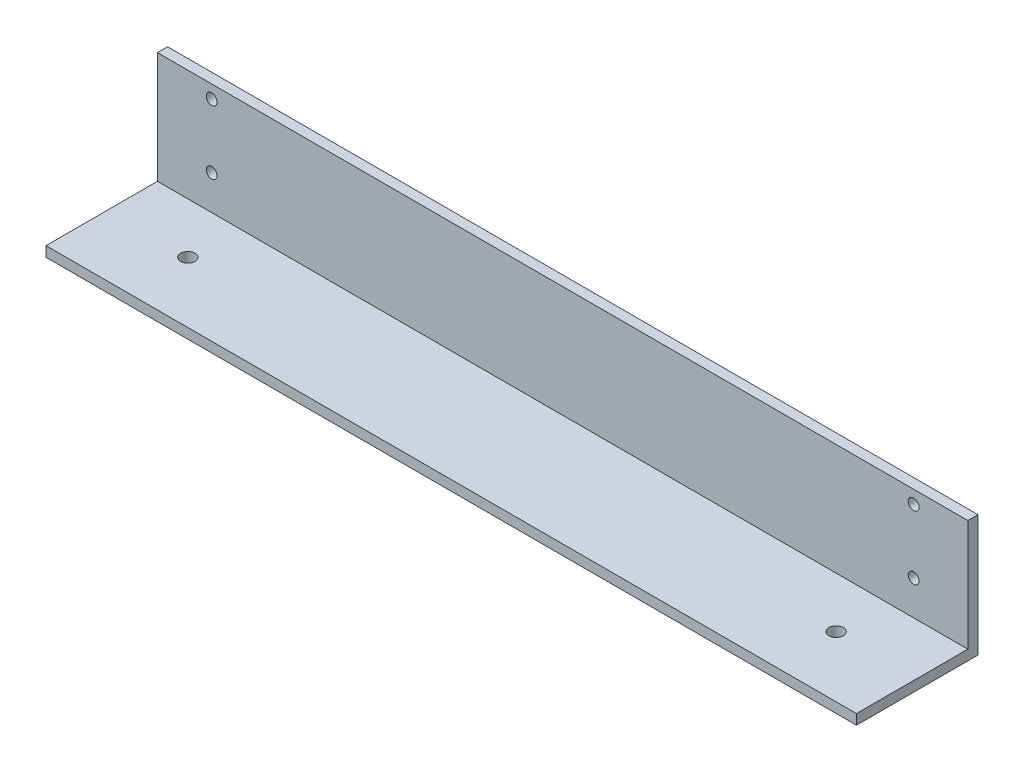
ISO-10303-21;
HEADER;
FILE_DESCRIPTION(('STEP AP214'),'2;1');
FILE_NAME('part.step','',(''),(''),'','','');
FILE_SCHEMA(('AUTOMOTIVE_DESIGN { 1 0 10303 214 1 1 1 1 }'));
ENDSEC;
DATA;
#1=APPLICATION_CONTEXT('core data for automotive mechanical design processes');
#2=APPLICATION_PROTOCOL_DEFINITION('international standard','automotive_design',2000,#1);
#3=PRODUCT_CONTEXT('',#1,'mechanical');
#4=PRODUCT('Part','Part','',(#3));
#5=PRODUCT_RELATED_PRODUCT_CATEGORY('part','',(#4));
#6=PRODUCT_DEFINITION_FORMATION('','',#4);
#7=PRODUCT_DEFINITION_CONTEXT('part definition',#1,'design');
#8=PRODUCT_DEFINITION('design','',#6,#7);
#9=PRODUCT_DEFINITION_SHAPE('','',#8);
#10=(LENGTH_UNIT() NAMED_UNIT(*) SI_UNIT(.MILLI.,.METRE.));
#11=(NAMED_UNIT(*) PLANE_ANGLE_UNIT() SI_UNIT($,.RADIAN.));
#12=(NAMED_UNIT(*) SI_UNIT($,.STERADIAN.) SOLID_ANGLE_UNIT());
#13=UNCERTAINTY_MEASURE_WITH_UNIT(LENGTH_MEASURE(1.E-05),#10,'distance_accuracy_value','');
#14=(GEOMETRIC_REPRESENTATION_CONTEXT(3) GLOBAL_UNCERTAINTY_ASSIGNED_CONTEXT((#13)) GLOBAL_UNIT_ASSIGNED_CONTEXT((#10,
#11,#12)) REPRESENTATION_CONTEXT('',''));
#15=CARTESIAN_POINT('',(0.,0.,0.));
#16=DIRECTION('',(0.,0.,1.));
#17=DIRECTION('',(1.,0.,0.));
#18=AXIS2_PLACEMENT_3D('',#15,#16,#17);
#19=CARTESIAN_POINT('',(254.,0.,0.));
#20=DIRECTION('',(0.,0.,-1.));
#21=DIRECTION('',(-1.,0.,0.));
#22=AXIS2_PLACEMENT_3D('',#19,#20,#21);
#23=PLANE('',#22);
#24=CARTESIAN_POINT('',(17.,30.825,0.));
#25=DIRECTION('',(0.,0.,1.));
#26=DIRECTION('',(1.,0.,0.));
#27=AXIS2_PLACEMENT_3D('',#24,#25,#26);
#28=CIRCLE('',#27,1.69999999999999);
#29=CARTESIAN_POINT('',(18.7,30.825,0.));
#30=VERTEX_POINT('',#29);
#31=EDGE_CURVE('E164',#30,#30,#28,.T.);
#32=ORIENTED_EDGE('',*,*,#31,.F.);
#33=EDGE_LOOP('',(#32));
#34=FACE_BOUND('',#33,.T.);
#35=CARTESIAN_POINT('',(17.,10.825,0.));
#36=DIRECTION('',(0.,0.,1.));
#37=DIRECTION('',(1.,0.,0.));
#38=AXIS2_PLACEMENT_3D('',#35,#36,#37);
#39=CIRCLE('',#38,1.69999999999999);
#40=CARTESIAN_POINT('',(18.7,10.825,0.));
#41=VERTEX_POINT('',#40);
#42=EDGE_CURVE('E168',#41,#41,#39,.T.);
#43=ORIENTED_EDGE('',*,*,#42,.F.);
#44=EDGE_LOOP('',(#43));
#45=FACE_BOUND('',#44,.T.);
#46=CARTESIAN_POINT('',(237.,10.825,0.));
#47=DIRECTION('',(0.,0.,1.));
#48=DIRECTION('',(1.,0.,0.));
#49=AXIS2_PLACEMENT_3D('',#46,#47,#48);
#50=CIRCLE('',#49,1.69999999999998);
#51=CARTESIAN_POINT('',(238.7,10.825,0.));
#52=VERTEX_POINT('',#51);
#53=EDGE_CURVE('E172',#52,#52,#50,.T.);
#54=ORIENTED_EDGE('',*,*,#53,.F.);
#55=EDGE_LOOP('',(#54));
#56=FACE_BOUND('',#55,.T.);
#57=CARTESIAN_POINT('',(237.,30.825,0.));
#58=DIRECTION('',(0.,0.,1.));
#59=DIRECTION('',(1.,0.,0.));
#60=AXIS2_PLACEMENT_3D('',#57,#58,#59);
#61=CIRCLE('',#60,1.69999999999998);
#62=CARTESIAN_POINT('',(238.7,30.825,0.));
#63=VERTEX_POINT('',#62);
#64=EDGE_CURVE('E175',#63,#63,#61,.T.);
#65=ORIENTED_EDGE('',*,*,#64,.F.);
#66=EDGE_LOOP('',(#65));
#67=FACE_BOUND('',#66,.T.);
#68=DIRECTION('',(0.,-1.,0.));
#69=VECTOR('',#68,1.);
#70=CARTESIAN_POINT('',(0.,0.,0.));
#71=LINE('',#70,#69);
#72=CARTESIAN_POINT('',(0.,34.925,0.));
#73=VERTEX_POINT('',#72);
#74=CARTESIAN_POINT('',(0.,0.,0.));
#75=VERTEX_POINT('',#74);
#76=EDGE_CURVE('E119',#73,#75,#71,.T.);
#77=ORIENTED_EDGE('',*,*,#76,.T.);
#78=DIRECTION('',(-1.,0.,0.));
#79=VECTOR('',#78,1.);
#80=CARTESIAN_POINT('',(254.,0.,0.));
#81=LINE('',#80,#79);
#82=CARTESIAN_POINT('',(254.,0.,0.));
#83=VERTEX_POINT('',#82);
#84=EDGE_CURVE('E11',#83,#75,#81,.T.);
#85=ORIENTED_EDGE('',*,*,#84,.F.);
#86=DIRECTION('',(0.,-1.,0.));
#87=VECTOR('',#86,1.);
#88=CARTESIAN_POINT('',(254.,0.,0.));
#89=LINE('',#88,#87);
#90=CARTESIAN_POINT('',(254.,34.925,0.));
#91=VERTEX_POINT('',#90);
#92=EDGE_CURVE('E130',#91,#83,#89,.T.);
#93=ORIENTED_EDGE('',*,*,#92,.F.);
#94=DIRECTION('',(-1.,0.,0.));
#95=VECTOR('',#94,1.);
#96=CARTESIAN_POINT('',(254.,34.925,0.));
#97=LINE('',#96,#95);
#98=EDGE_CURVE('E115',#91,#73,#97,.T.);
#99=ORIENTED_EDGE('',*,*,#98,.T.);
#100=EDGE_LOOP('',(#77,#85,#93,#99));
#101=FACE_BOUND('',#100,.T.);
#102=ADVANCED_FACE('F35',(#34,#45,#56,#67,#101),#23,.F.);
#103=CARTESIAN_POINT('',(254.,0.,0.));
#104=DIRECTION('',(0.,-1.,0.));
#105=DIRECTION('',(0.,0.,-1.));
#106=AXIS2_PLACEMENT_3D('',#103,#104,#105);
#107=PLANE('',#106);
#108=CARTESIAN_POINT('',(25.4,0.,15.875));
#109=DIRECTION('',(0.,1.,0.));
#110=DIRECTION('',(0.,0.,1.));
#111=AXIS2_PLACEMENT_3D('',#108,#109,#110);
#112=CIRCLE('',#111,2.2479);
#113=CARTESIAN_POINT('',(25.4,0.,18.1229));
#114=VERTEX_POINT('',#113);
#115=EDGE_CURVE('E204',#114,#114,#112,.T.);
#116=ORIENTED_EDGE('',*,*,#115,.F.);
#117=EDGE_LOOP('',(#116));
#118=FACE_BOUND('',#117,.T.);
#119=CARTESIAN_POINT('',(228.6,0.,15.875));
#120=DIRECTION('',(0.,1.,0.));
#121=DIRECTION('',(0.,0.,1.));
#122=AXIS2_PLACEMENT_3D('',#119,#120,#121);
#123=CIRCLE('',#122,2.2479);
#124=CARTESIAN_POINT('',(228.6,0.,18.1229));
#125=VERTEX_POINT('',#124);
#126=EDGE_CURVE('E198',#125,#125,#123,.T.);
#127=ORIENTED_EDGE('',*,*,#126,.F.);
#128=EDGE_LOOP('',(#127));
#129=FACE_BOUND('',#128,.T.);
#130=DIRECTION('',(0.,0.,1.));
#131=VECTOR('',#130,1.);
#132=CARTESIAN_POINT('',(0.,0.,0.));
#133=LINE('',#132,#131);
#134=CARTESIAN_POINT('',(0.,0.,34.925));
#135=VERTEX_POINT('',#134);
#136=EDGE_CURVE('E122',#75,#135,#133,.T.);
#137=ORIENTED_EDGE('',*,*,#136,.T.);
#138=DIRECTION('',(-1.,0.,0.));
#139=VECTOR('',#138,1.);
#140=CARTESIAN_POINT('',(254.,0.,34.925));
#141=LINE('',#140,#139);
#142=CARTESIAN_POINT('',(254.,0.,34.925));
#143=VERTEX_POINT('',#142);
#144=EDGE_CURVE('E43',#143,#135,#141,.T.);
#145=ORIENTED_EDGE('',*,*,#144,.F.);
#146=DIRECTION('',(0.,0.,1.));
#147=VECTOR('',#146,1.);
#148=CARTESIAN_POINT('',(254.,0.,0.));
#149=LINE('',#148,#147);
#150=EDGE_CURVE('E88',#83,#143,#149,.T.);
#151=ORIENTED_EDGE('',*,*,#150,.F.);
#152=ORIENTED_EDGE('',*,*,#84,.T.);
#153=EDGE_LOOP('',(#137,#145,#151,#152));
#154=FACE_BOUND('',#153,.T.);
#155=ADVANCED_FACE('F155',(#118,#129,#154),#107,.F.);
#156=CARTESIAN_POINT('',(254.,0.,34.925));
#157=DIRECTION('',(0.,0.,-1.));
#158=DIRECTION('',(-1.,0.,0.));
#159=AXIS2_PLACEMENT_3D('',#156,#157,#158);
#160=PLANE('',#159);
#161=DIRECTION('',(0.,-1.,0.));
#162=VECTOR('',#161,1.);
#163=CARTESIAN_POINT('',(0.,0.,34.925));
#164=LINE('',#163,#162);
#165=CARTESIAN_POINT('',(0.,-3.175,34.925));
#166=VERTEX_POINT('',#165);
#167=EDGE_CURVE('E125',#135,#166,#164,.T.);
#168=ORIENTED_EDGE('',*,*,#167,.T.);
#169=DIRECTION('',(-1.,0.,0.));
#170=VECTOR('',#169,1.);
#171=CARTESIAN_POINT('',(254.,-3.175,34.925));
#172=LINE('',#171,#170);
#173=CARTESIAN_POINT('',(254.,-3.175,34.925));
#174=VERTEX_POINT('',#173);
#175=EDGE_CURVE('E110',#174,#166,#172,.T.);
#176=ORIENTED_EDGE('',*,*,#175,.F.);
#177=DIRECTION('',(0.,-1.,0.));
#178=VECTOR('',#177,1.);
#179=CARTESIAN_POINT('',(254.,0.,34.925));
#180=LINE('',#179,#178);
#181=EDGE_CURVE('E101',#143,#174,#180,.T.);
#182=ORIENTED_EDGE('',*,*,#181,.F.);
#183=ORIENTED_EDGE('',*,*,#144,.T.);
#184=EDGE_LOOP('',(#168,#176,#182,#183));
#185=FACE_BOUND('',#184,.T.);
#186=ADVANCED_FACE('F136',(#185),#160,.F.);
#187=CARTESIAN_POINT('',(254.,-3.175,34.925));
#188=DIRECTION('',(0.,1.,0.));
#189=DIRECTION('',(0.,0.,1.));
#190=AXIS2_PLACEMENT_3D('',#187,#188,#189);
#191=PLANE('',#190);
#192=CARTESIAN_POINT('',(25.4,-3.175,15.875));
#193=DIRECTION('',(0.,1.,0.));
#194=DIRECTION('',(0.,0.,1.));
#195=AXIS2_PLACEMENT_3D('',#192,#193,#194);
#196=CIRCLE('',#195,2.2479);
#197=CARTESIAN_POINT('',(25.4,-3.175,18.1229));
#198=VERTEX_POINT('',#197);
#199=EDGE_CURVE('E201',#198,#198,#196,.T.);
#200=ORIENTED_EDGE('',*,*,#199,.T.);
#201=EDGE_LOOP('',(#200));
#202=FACE_BOUND('',#201,.T.);
#203=CARTESIAN_POINT('',(228.6,-3.175,15.875));
#204=DIRECTION('',(0.,1.,0.));
#205=DIRECTION('',(0.,0.,1.));
#206=AXIS2_PLACEMENT_3D('',#203,#204,#205);
#207=CIRCLE('',#206,2.2479);
#208=CARTESIAN_POINT('',(228.6,-3.175,18.1229));
#209=VERTEX_POINT('',#208);
#210=EDGE_CURVE('E195',#209,#209,#207,.T.);
#211=ORIENTED_EDGE('',*,*,#210,.T.);
#212=EDGE_LOOP('',(#211));
#213=FACE_BOUND('',#212,.T.);
#214=DIRECTION('',(0.,0.,-1.));
#215=VECTOR('',#214,1.);
#216=CARTESIAN_POINT('',(0.,-3.175,34.925));
#217=LINE('',#216,#215);
#218=CARTESIAN_POINT('',(0.,-3.175,-3.175));
#219=VERTEX_POINT('',#218);
#220=EDGE_CURVE('E109',#166,#219,#217,.T.);
#221=ORIENTED_EDGE('',*,*,#220,.T.);
#222=DIRECTION('',(-1.,0.,0.));
#223=VECTOR('',#222,1.);
#224=CARTESIAN_POINT('',(254.,-3.175,-3.175));
#225=LINE('',#224,#223);
#226=CARTESIAN_POINT('',(254.,-3.175,-3.175));
#227=VERTEX_POINT('',#226);
#228=EDGE_CURVE('E106',#227,#219,#225,.T.);
#229=ORIENTED_EDGE('',*,*,#228,.F.);
#230=DIRECTION('',(0.,0.,-1.));
#231=VECTOR('',#230,1.);
#232=CARTESIAN_POINT('',(254.,-3.175,34.925));
#233=LINE('',#232,#231);
#234=EDGE_CURVE('E95',#174,#227,#233,.T.);
#235=ORIENTED_EDGE('',*,*,#234,.F.);
#236=ORIENTED_EDGE('',*,*,#175,.T.);
#237=EDGE_LOOP('',(#221,#229,#235,#236));
#238=FACE_BOUND('',#237,.T.);
#239=ADVANCED_FACE('F107',(#202,#213,#238),#191,.F.);
#240=CARTESIAN_POINT('',(254.,34.925,-3.175));
#241=DIRECTION('',(0.,0.,1.));
#242=DIRECTION('',(0.,-1.,0.));
#243=AXIS2_PLACEMENT_3D('',#240,#241,#242);
#244=PLANE('',#243);
#245=CARTESIAN_POINT('',(17.,30.825,-3.175));
#246=DIRECTION('',(0.,0.,1.));
#247=DIRECTION('',(1.,0.,0.));
#248=AXIS2_PLACEMENT_3D('',#245,#246,#247);
#249=CIRCLE('',#248,1.7);
#250=CARTESIAN_POINT('',(18.7,30.825,-3.175));
#251=VERTEX_POINT('',#250);
#252=EDGE_CURVE('E191',#251,#251,#249,.T.);
#253=ORIENTED_EDGE('',*,*,#252,.T.);
#254=EDGE_LOOP('',(#253));
#255=FACE_BOUND('',#254,.T.);
#256=CARTESIAN_POINT('',(17.,10.825,-3.175));
#257=DIRECTION('',(0.,0.,1.));
#258=DIRECTION('',(1.,0.,0.));
#259=AXIS2_PLACEMENT_3D('',#256,#257,#258);
#260=CIRCLE('',#259,1.7);
#261=CARTESIAN_POINT('',(18.7,10.825,-3.175));
#262=VERTEX_POINT('',#261);
#263=EDGE_CURVE('E187',#262,#262,#260,.T.);
#264=ORIENTED_EDGE('',*,*,#263,.T.);
#265=EDGE_LOOP('',(#264));
#266=FACE_BOUND('',#265,.T.);
#267=CARTESIAN_POINT('',(237.,10.825,-3.175));
#268=DIRECTION('',(0.,0.,1.));
#269=DIRECTION('',(1.,0.,0.));
#270=AXIS2_PLACEMENT_3D('',#267,#268,#269);
#271=CIRCLE('',#270,1.70000000000001);
#272=CARTESIAN_POINT('',(238.7,10.825,-3.175));
#273=VERTEX_POINT('',#272);
#274=EDGE_CURVE('E177',#273,#273,#271,.T.);
#275=ORIENTED_EDGE('',*,*,#274,.T.);
#276=EDGE_LOOP('',(#275));
#277=FACE_BOUND('',#276,.T.);
#278=CARTESIAN_POINT('',(237.,30.825,-3.175));
#279=DIRECTION('',(0.,0.,1.));
#280=DIRECTION('',(1.,0.,0.));
#281=AXIS2_PLACEMENT_3D('',#278,#279,#280);
#282=CIRCLE('',#281,1.70000000000001);
#283=CARTESIAN_POINT('',(238.7,30.825,-3.175));
#284=VERTEX_POINT('',#283);
#285=EDGE_CURVE('E123',#284,#284,#282,.T.);
#286=ORIENTED_EDGE('',*,*,#285,.T.);
#287=EDGE_LOOP('',(#286));
#288=FACE_BOUND('',#287,.T.);
#289=DIRECTION('',(0.,1.,0.));
#290=VECTOR('',#289,1.);
#291=CARTESIAN_POINT('',(0.,34.925,-3.175));
#292=LINE('',#291,#290);
#293=CARTESIAN_POINT('',(0.,34.925,-3.175));
#294=VERTEX_POINT('',#293);
#295=EDGE_CURVE('E74',#219,#294,#292,.T.);
#296=ORIENTED_EDGE('',*,*,#295,.T.);
#297=DIRECTION('',(-1.,0.,0.));
#298=VECTOR('',#297,1.);
#299=CARTESIAN_POINT('',(254.,34.925,-3.175));
#300=LINE('',#299,#298);
#301=CARTESIAN_POINT('',(254.,34.925,-3.175));
#302=VERTEX_POINT('',#301);
#303=EDGE_CURVE('E111',#302,#294,#300,.T.);
#304=ORIENTED_EDGE('',*,*,#303,.F.);
#305=DIRECTION('',(0.,1.,0.));
#306=VECTOR('',#305,1.);
#307=CARTESIAN_POINT('',(254.,34.925,-3.175));
#308=LINE('',#307,#306);
#309=EDGE_CURVE('E99',#227,#302,#308,.T.);
#310=ORIENTED_EDGE('',*,*,#309,.F.);
#311=ORIENTED_EDGE('',*,*,#228,.T.);
#312=EDGE_LOOP('',(#296,#304,#310,#311));
#313=FACE_BOUND('',#312,.T.);
#314=ADVANCED_FACE('F113',(#255,#266,#277,#288,#313),#244,.F.);
#315=CARTESIAN_POINT('',(254.,34.925,0.));
#316=DIRECTION('',(0.,-1.,0.));
#317=DIRECTION('',(0.,0.,-1.));
#318=AXIS2_PLACEMENT_3D('',#315,#316,#317);
#319=PLANE('',#318);
#320=DIRECTION('',(0.,0.,1.));
#321=VECTOR('',#320,1.);
#322=CARTESIAN_POINT('',(0.,34.925,0.));
#323=LINE('',#322,#321);
#324=EDGE_CURVE('E80',#294,#73,#323,.T.);
#325=ORIENTED_EDGE('',*,*,#324,.T.);
#326=ORIENTED_EDGE('',*,*,#98,.F.);
#327=DIRECTION('',(0.,0.,1.));
#328=VECTOR('',#327,1.);
#329=CARTESIAN_POINT('',(254.,34.925,0.));
#330=LINE('',#329,#328);
#331=EDGE_CURVE('E51',#302,#91,#330,.T.);
#332=ORIENTED_EDGE('',*,*,#331,.F.);
#333=ORIENTED_EDGE('',*,*,#303,.T.);
#334=EDGE_LOOP('',(#325,#326,#332,#333));
#335=FACE_BOUND('',#334,.T.);
#336=ADVANCED_FACE('F143',(#335),#319,.F.);
#337=CARTESIAN_POINT('',(254.,0.,0.));
#338=DIRECTION('',(-1.,0.,0.));
#339=DIRECTION('',(0.,0.,1.));
#340=AXIS2_PLACEMENT_3D('',#337,#338,#339);
#341=PLANE('',#340);
#342=ORIENTED_EDGE('',*,*,#92,.T.);
#343=ORIENTED_EDGE('',*,*,#150,.T.);
#344=ORIENTED_EDGE('',*,*,#181,.T.);
#345=ORIENTED_EDGE('',*,*,#234,.T.);
#346=ORIENTED_EDGE('',*,*,#309,.T.);
#347=ORIENTED_EDGE('',*,*,#331,.T.);
#348=EDGE_LOOP('',(#342,#343,#344,#345,#346,#347));
#349=FACE_BOUND('',#348,.T.);
#350=ADVANCED_FACE('F97',(#349),#341,.F.);
#351=CARTESIAN_POINT('',(0.,0.,0.));
#352=DIRECTION('',(-1.,0.,0.));
#353=DIRECTION('',(0.,0.,1.));
#354=AXIS2_PLACEMENT_3D('',#351,#352,#353);
#355=PLANE('',#354);
#356=ORIENTED_EDGE('',*,*,#76,.F.);
#357=ORIENTED_EDGE('',*,*,#324,.F.);
#358=ORIENTED_EDGE('',*,*,#295,.F.);
#359=ORIENTED_EDGE('',*,*,#220,.F.);
#360=ORIENTED_EDGE('',*,*,#167,.F.);
#361=ORIENTED_EDGE('',*,*,#136,.F.);
#362=EDGE_LOOP('',(#356,#357,#358,#359,#360,#361));
#363=FACE_BOUND('',#362,.T.);
#364=ADVANCED_FACE('F139',(#363),#355,.T.);
#365=CARTESIAN_POINT('',(237.,30.825,0.));
#366=DIRECTION('',(0.,0.,1.));
#367=DIRECTION('',(1.,0.,0.));
#368=AXIS2_PLACEMENT_3D('',#365,#366,#367);
#369=CYLINDRICAL_SURFACE('',#368,1.69999999999999);
#370=ORIENTED_EDGE('',*,*,#285,.F.);
#371=EDGE_LOOP('',(#370));
#372=FACE_BOUND('',#371,.T.);
#373=ORIENTED_EDGE('',*,*,#64,.T.);
#374=EDGE_LOOP('',(#373));
#375=FACE_BOUND('',#374,.T.);
#376=ADVANCED_FACE('F234',(#372,#375),#369,.F.);
#377=CARTESIAN_POINT('',(237.,10.825,0.));
#378=DIRECTION('',(0.,0.,1.));
#379=DIRECTION('',(1.,0.,0.));
#380=AXIS2_PLACEMENT_3D('',#377,#378,#379);
#381=CYLINDRICAL_SURFACE('',#380,1.69999999999999);
#382=ORIENTED_EDGE('',*,*,#274,.F.);
#383=EDGE_LOOP('',(#382));
#384=FACE_BOUND('',#383,.T.);
#385=ORIENTED_EDGE('',*,*,#53,.T.);
#386=EDGE_LOOP('',(#385));
#387=FACE_BOUND('',#386,.T.);
#388=ADVANCED_FACE('F230',(#384,#387),#381,.F.);
#389=CARTESIAN_POINT('',(17.,10.825,0.));
#390=DIRECTION('',(0.,0.,1.));
#391=DIRECTION('',(1.,0.,0.));
#392=AXIS2_PLACEMENT_3D('',#389,#390,#391);
#393=CYLINDRICAL_SURFACE('',#392,1.69999999999999);
#394=ORIENTED_EDGE('',*,*,#263,.F.);
#395=EDGE_LOOP('',(#394));
#396=FACE_BOUND('',#395,.T.);
#397=ORIENTED_EDGE('',*,*,#42,.T.);
#398=EDGE_LOOP('',(#397));
#399=FACE_BOUND('',#398,.T.);
#400=ADVANCED_FACE('F223',(#396,#399),#393,.F.);
#401=CARTESIAN_POINT('',(17.,30.825,0.));
#402=DIRECTION('',(0.,0.,1.));
#403=DIRECTION('',(1.,0.,0.));
#404=AXIS2_PLACEMENT_3D('',#401,#402,#403);
#405=CYLINDRICAL_SURFACE('',#404,1.69999999999999);
#406=ORIENTED_EDGE('',*,*,#252,.F.);
#407=EDGE_LOOP('',(#406));
#408=FACE_BOUND('',#407,.T.);
#409=ORIENTED_EDGE('',*,*,#31,.T.);
#410=EDGE_LOOP('',(#409));
#411=FACE_BOUND('',#410,.T.);
#412=ADVANCED_FACE('F214',(#408,#411),#405,.F.);
#413=CARTESIAN_POINT('',(228.6,0.,15.875));
#414=DIRECTION('',(0.,1.,0.));
#415=DIRECTION('',(0.,0.,1.));
#416=AXIS2_PLACEMENT_3D('',#413,#414,#415);
#417=CYLINDRICAL_SURFACE('',#416,2.2479);
#418=ORIENTED_EDGE('',*,*,#210,.F.);
#419=EDGE_LOOP('',(#418));
#420=FACE_BOUND('',#419,.T.);
#421=ORIENTED_EDGE('',*,*,#126,.T.);
#422=EDGE_LOOP('',(#421));
#423=FACE_BOUND('',#422,.T.);
#424=ADVANCED_FACE('F212',(#420,#423),#417,.F.);
#425=CARTESIAN_POINT('',(25.4,0.,15.875));
#426=DIRECTION('',(0.,1.,0.));
#427=DIRECTION('',(0.,0.,1.));
#428=AXIS2_PLACEMENT_3D('',#425,#426,#427);
#429=CYLINDRICAL_SURFACE('',#428,2.2479);
#430=ORIENTED_EDGE('',*,*,#199,.F.);
#431=EDGE_LOOP('',(#430));
#432=FACE_BOUND('',#431,.T.);
#433=ORIENTED_EDGE('',*,*,#115,.T.);
#434=EDGE_LOOP('',(#433));
#435=FACE_BOUND('',#434,.T.);
#436=ADVANCED_FACE('F208',(#432,#435),#429,.F.);
#437=CLOSED_SHELL('',(#102,#155,#186,#239,#314,#336,#350,#364,#376,#388,#400,#412,#424,#436));
#438=MANIFOLD_SOLID_BREP('B2',#437);
#439=ADVANCED_BREP_SHAPE_REPRESENTATION('',(#18,#438),#14);
#440=SHAPE_DEFINITION_REPRESENTATION(#9,#439);
ENDSEC;
END-ISO-10303-21;
